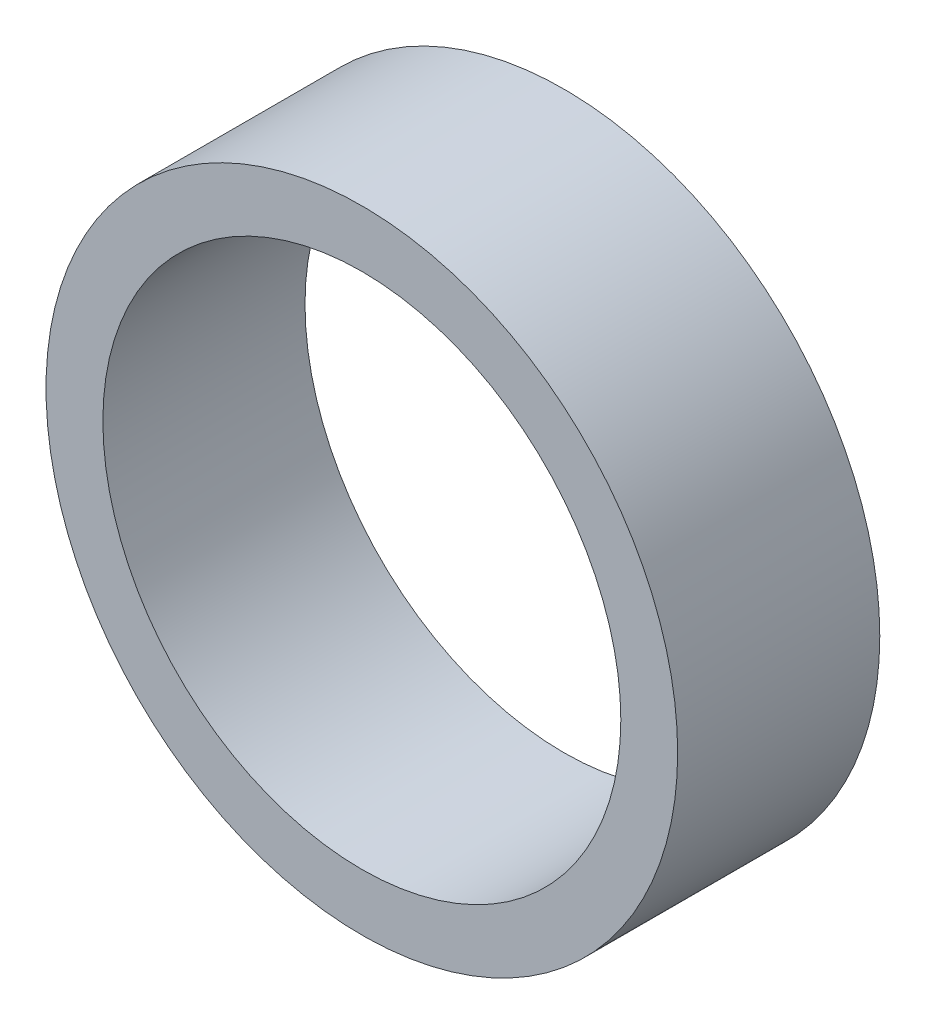
ISO-10303-21;
HEADER;
FILE_DESCRIPTION(('STEP AP214'),'2;1');
FILE_NAME('part.step','',(''),(''),'','','');
FILE_SCHEMA(('AUTOMOTIVE_DESIGN { 1 0 10303 214 1 1 1 1 }'));
ENDSEC;
DATA;
#1=APPLICATION_CONTEXT('core data for automotive mechanical design processes');
#2=APPLICATION_PROTOCOL_DEFINITION('international standard','automotive_design',2000,#1);
#3=PRODUCT_CONTEXT('',#1,'mechanical');
#4=PRODUCT('Part','Part','',(#3));
#5=PRODUCT_RELATED_PRODUCT_CATEGORY('part','',(#4));
#6=PRODUCT_DEFINITION_FORMATION('','',#4);
#7=PRODUCT_DEFINITION_CONTEXT('part definition',#1,'design');
#8=PRODUCT_DEFINITION('design','',#6,#7);
#9=PRODUCT_DEFINITION_SHAPE('','',#8);
#10=(LENGTH_UNIT() NAMED_UNIT(*) SI_UNIT(.MILLI.,.METRE.));
#11=(NAMED_UNIT(*) PLANE_ANGLE_UNIT() SI_UNIT($,.RADIAN.));
#12=(NAMED_UNIT(*) SI_UNIT($,.STERADIAN.) SOLID_ANGLE_UNIT());
#13=UNCERTAINTY_MEASURE_WITH_UNIT(LENGTH_MEASURE(1.E-05),#10,'distance_accuracy_value','');
#14=(GEOMETRIC_REPRESENTATION_CONTEXT(3) GLOBAL_UNCERTAINTY_ASSIGNED_CONTEXT((#13)) GLOBAL_UNIT_ASSIGNED_CONTEXT((#10,
#11,#12)) REPRESENTATION_CONTEXT('',''));
#15=CARTESIAN_POINT('',(0.,0.,0.));
#16=DIRECTION('',(0.,0.,1.));
#17=DIRECTION('',(1.,0.,0.));
#18=AXIS2_PLACEMENT_3D('',#15,#16,#17);
#19=CARTESIAN_POINT('',(0.,0.,8.));
#20=DIRECTION('',(0.,0.,1.));
#21=DIRECTION('',(1.,0.,0.));
#22=AXIS2_PLACEMENT_3D('',#19,#20,#21);
#23=PLANE('',#22);
#24=CARTESIAN_POINT('',(0.,0.,8.));
#25=DIRECTION('',(0.,0.,1.));
#26=DIRECTION('',(1.,0.,0.));
#27=AXIS2_PLACEMENT_3D('',#24,#25,#26);
#28=CIRCLE('',#27,12.5);
#29=CARTESIAN_POINT('',(12.5,0.,8.));
#30=VERTEX_POINT('',#29);
#31=EDGE_CURVE('E10',#30,#30,#28,.T.);
#32=ORIENTED_EDGE('',*,*,#31,.T.);
#33=EDGE_LOOP('',(#32));
#34=FACE_BOUND('',#33,.T.);
#35=CARTESIAN_POINT('',(0.,0.,8.));
#36=DIRECTION('',(0.,0.,1.));
#37=DIRECTION('',(1.,0.,0.));
#38=AXIS2_PLACEMENT_3D('',#35,#36,#37);
#39=CIRCLE('',#38,10.25);
#40=CARTESIAN_POINT('',(10.25,0.,8.));
#41=VERTEX_POINT('',#40);
#42=EDGE_CURVE('E45',#41,#41,#39,.T.);
#43=ORIENTED_EDGE('',*,*,#42,.F.);
#44=EDGE_LOOP('',(#43));
#45=FACE_BOUND('',#44,.T.);
#46=ADVANCED_FACE('F34',(#34,#45),#23,.T.);
#47=CARTESIAN_POINT('',(0.,0.,0.));
#48=DIRECTION('',(0.,0.,1.));
#49=DIRECTION('',(1.,0.,0.));
#50=AXIS2_PLACEMENT_3D('',#47,#48,#49);
#51=PLANE('',#50);
#52=CARTESIAN_POINT('',(0.,0.,0.));
#53=DIRECTION('',(0.,0.,1.));
#54=DIRECTION('',(1.,0.,0.));
#55=AXIS2_PLACEMENT_3D('',#52,#53,#54);
#56=CIRCLE('',#55,12.5);
#57=CARTESIAN_POINT('',(12.5,0.,0.));
#58=VERTEX_POINT('',#57);
#59=EDGE_CURVE('E38',#58,#58,#56,.T.);
#60=ORIENTED_EDGE('',*,*,#59,.F.);
#61=EDGE_LOOP('',(#60));
#62=FACE_BOUND('',#61,.T.);
#63=CARTESIAN_POINT('',(0.,0.,0.));
#64=DIRECTION('',(0.,0.,1.));
#65=DIRECTION('',(1.,0.,0.));
#66=AXIS2_PLACEMENT_3D('',#63,#64,#65);
#67=CIRCLE('',#66,10.25);
#68=CARTESIAN_POINT('',(10.25,0.,0.));
#69=VERTEX_POINT('',#68);
#70=EDGE_CURVE('E47',#69,#69,#67,.T.);
#71=ORIENTED_EDGE('',*,*,#70,.T.);
#72=EDGE_LOOP('',(#71));
#73=FACE_BOUND('',#72,.T.);
#74=ADVANCED_FACE('F57',(#62,#73),#51,.F.);
#75=CARTESIAN_POINT('',(0.,0.,8.));
#76=DIRECTION('',(0.,0.,-1.));
#77=DIRECTION('',(-1.,0.,0.));
#78=AXIS2_PLACEMENT_3D('',#75,#76,#77);
#79=CYLINDRICAL_SURFACE('',#78,12.5);
#80=ORIENTED_EDGE('',*,*,#31,.F.);
#81=EDGE_LOOP('',(#80));
#82=FACE_BOUND('',#81,.T.);
#83=ORIENTED_EDGE('',*,*,#59,.T.);
#84=EDGE_LOOP('',(#83));
#85=FACE_BOUND('',#84,.T.);
#86=ADVANCED_FACE('F36',(#82,#85),#79,.T.);
#87=CARTESIAN_POINT('',(0.,0.,8.));
#88=DIRECTION('',(0.,0.,-1.));
#89=DIRECTION('',(-1.,0.,0.));
#90=AXIS2_PLACEMENT_3D('',#87,#88,#89);
#91=CYLINDRICAL_SURFACE('',#90,10.25);
#92=ORIENTED_EDGE('',*,*,#42,.T.);
#93=EDGE_LOOP('',(#92));
#94=FACE_BOUND('',#93,.T.);
#95=ORIENTED_EDGE('',*,*,#70,.F.);
#96=EDGE_LOOP('',(#95));
#97=FACE_BOUND('',#96,.T.);
#98=ADVANCED_FACE('F53',(#94,#97),#91,.F.);
#99=CLOSED_SHELL('',(#46,#74,#86,#98));
#100=MANIFOLD_SOLID_BREP('B2',#99);
#101=ADVANCED_BREP_SHAPE_REPRESENTATION('',(#18,#100),#14);
#102=SHAPE_DEFINITION_REPRESENTATION(#9,#101);
ENDSEC;
END-ISO-10303-21;
